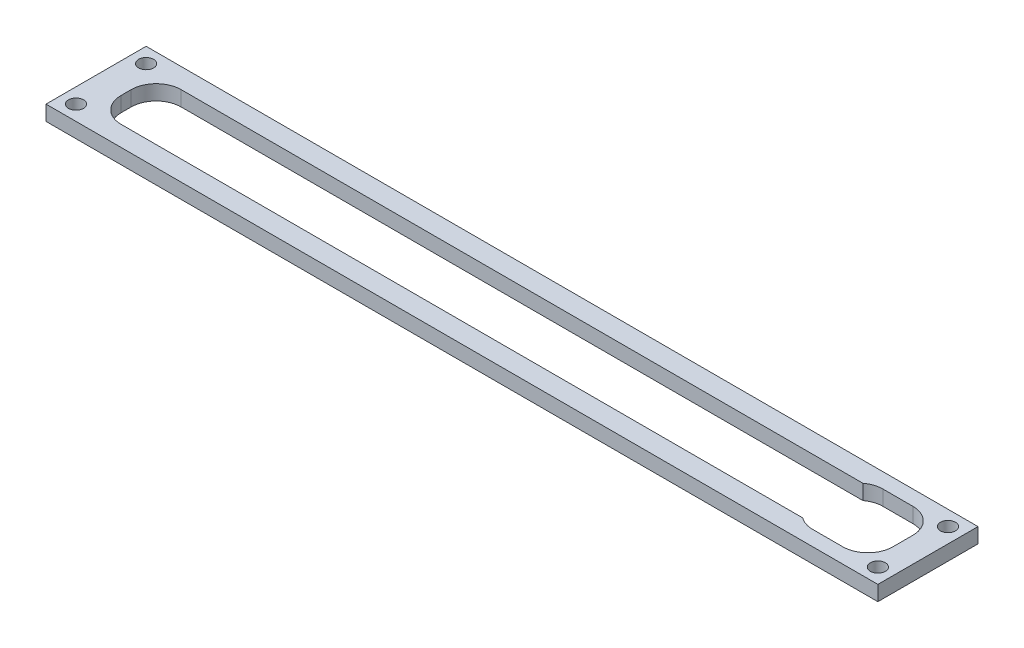
ISO-10303-21;
HEADER;
FILE_DESCRIPTION(('STEP AP214'),'2;1');
FILE_NAME('part.step','',(''),(''),'','','');
FILE_SCHEMA(('AUTOMOTIVE_DESIGN { 1 0 10303 214 1 1 1 1 }'));
ENDSEC;
DATA;
#1=APPLICATION_CONTEXT('core data for automotive mechanical design processes');
#2=APPLICATION_PROTOCOL_DEFINITION('international standard','automotive_design',2000,#1);
#3=PRODUCT_CONTEXT('',#1,'mechanical');
#4=PRODUCT('Part','Part','',(#3));
#5=PRODUCT_RELATED_PRODUCT_CATEGORY('part','',(#4));
#6=PRODUCT_DEFINITION_FORMATION('','',#4);
#7=PRODUCT_DEFINITION_CONTEXT('part definition',#1,'design');
#8=PRODUCT_DEFINITION('design','',#6,#7);
#9=PRODUCT_DEFINITION_SHAPE('','',#8);
#10=(LENGTH_UNIT() NAMED_UNIT(*) SI_UNIT(.MILLI.,.METRE.));
#11=(NAMED_UNIT(*) PLANE_ANGLE_UNIT() SI_UNIT($,.RADIAN.));
#12=(NAMED_UNIT(*) SI_UNIT($,.STERADIAN.) SOLID_ANGLE_UNIT());
#13=UNCERTAINTY_MEASURE_WITH_UNIT(LENGTH_MEASURE(1.E-05),#10,'distance_accuracy_value','');
#14=(GEOMETRIC_REPRESENTATION_CONTEXT(3) GLOBAL_UNCERTAINTY_ASSIGNED_CONTEXT((#13)) GLOBAL_UNIT_ASSIGNED_CONTEXT((#10,
#11,#12)) REPRESENTATION_CONTEXT('',''));
#15=CARTESIAN_POINT('',(0.,0.,0.));
#16=DIRECTION('',(0.,0.,1.));
#17=DIRECTION('',(1.,0.,0.));
#18=AXIS2_PLACEMENT_3D('',#15,#16,#17);
#19=CARTESIAN_POINT('',(0.,3.,0.));
#20=DIRECTION('',(0.,-1.,0.));
#21=DIRECTION('',(0.,0.,-1.));
#22=AXIS2_PLACEMENT_3D('',#19,#20,#21);
#23=PLANE('',#22);
#24=DIRECTION('',(0.,0.,1.));
#25=VECTOR('',#24,1.);
#26=CARTESIAN_POINT('',(0.,3.,0.));
#27=LINE('',#26,#25);
#28=CARTESIAN_POINT('',(0.,3.,-20.));
#29=VERTEX_POINT('',#28);
#30=CARTESIAN_POINT('',(0.,3.,0.));
#31=VERTEX_POINT('',#30);
#32=EDGE_CURVE('E250',#29,#31,#27,.T.);
#33=ORIENTED_EDGE('',*,*,#32,.T.);
#34=DIRECTION('',(1.,0.,0.));
#35=VECTOR('',#34,1.);
#36=CARTESIAN_POINT('',(0.,3.,0.));
#37=LINE('',#36,#35);
#38=CARTESIAN_POINT('',(166.159725664004,3.,0.));
#39=VERTEX_POINT('',#38);
#40=EDGE_CURVE('E253',#31,#39,#37,.T.);
#41=ORIENTED_EDGE('',*,*,#40,.T.);
#42=DIRECTION('',(0.,0.,-1.));
#43=VECTOR('',#42,1.);
#44=CARTESIAN_POINT('',(166.159725664004,3.,0.));
#45=LINE('',#44,#43);
#46=CARTESIAN_POINT('',(166.159725664004,3.,-20.));
#47=VERTEX_POINT('',#46);
#48=EDGE_CURVE('E256',#39,#47,#45,.T.);
#49=ORIENTED_EDGE('',*,*,#48,.T.);
#50=DIRECTION('',(-1.,0.,0.));
#51=VECTOR('',#50,1.);
#52=CARTESIAN_POINT('',(0.,3.,-20.));
#53=LINE('',#52,#51);
#54=EDGE_CURVE('E258',#47,#29,#53,.T.);
#55=ORIENTED_EDGE('',*,*,#54,.T.);
#56=EDGE_LOOP('',(#33,#41,#49,#55));
#57=FACE_BOUND('',#56,.T.);
#58=DIRECTION('',(-1.,0.,0.));
#59=VECTOR('',#58,1.);
#60=CARTESIAN_POINT('',(5.99999999999999,3.,-16.));
#61=LINE('',#60,#59);
#62=CARTESIAN_POINT('',(147.159725664004,3.,-16.));
#63=VERTEX_POINT('',#62);
#64=CARTESIAN_POINT('',(11.,3.,-16.));
#65=VERTEX_POINT('',#64);
#66=EDGE_CURVE('E243',#63,#65,#61,.T.);
#67=ORIENTED_EDGE('',*,*,#66,.F.);
#68=CARTESIAN_POINT('',(150.159725664004,3.,-12.));
#69=DIRECTION('',(0.,-1.,0.));
#70=DIRECTION('',(0.,0.,-1.));
#71=AXIS2_PLACEMENT_3D('',#68,#69,#70);
#72=CIRCLE('',#71,5.);
#73=CARTESIAN_POINT('',(150.159725664004,3.,-17.));
#74=VERTEX_POINT('',#73);
#75=EDGE_CURVE('E193',#63,#74,#72,.T.);
#76=ORIENTED_EDGE('',*,*,#75,.T.);
#77=DIRECTION('',(-1.,0.,0.));
#78=VECTOR('',#77,1.);
#79=CARTESIAN_POINT('',(147.159725664004,3.,-17.));
#80=LINE('',#79,#78);
#81=CARTESIAN_POINT('',(156.159725664004,3.,-17.));
#82=VERTEX_POINT('',#81);
#83=EDGE_CURVE('E205',#82,#74,#80,.T.);
#84=ORIENTED_EDGE('',*,*,#83,.F.);
#85=CARTESIAN_POINT('',(156.159725664004,3.,-12.));
#86=DIRECTION('',(0.,-1.,0.));
#87=DIRECTION('',(0.,0.,-1.));
#88=AXIS2_PLACEMENT_3D('',#85,#86,#87);
#89=CIRCLE('',#88,5.);
#90=CARTESIAN_POINT('',(161.159725664004,3.,-12.));
#91=VERTEX_POINT('',#90);
#92=EDGE_CURVE('E185',#82,#91,#89,.T.);
#93=ORIENTED_EDGE('',*,*,#92,.T.);
#94=DIRECTION('',(0.,0.,-1.));
#95=VECTOR('',#94,1.);
#96=CARTESIAN_POINT('',(161.159725664004,3.,-17.));
#97=LINE('',#96,#95);
#98=CARTESIAN_POINT('',(161.159725664004,3.,-8.00000000000001));
#99=VERTEX_POINT('',#98);
#100=EDGE_CURVE('E202',#99,#91,#97,.T.);
#101=ORIENTED_EDGE('',*,*,#100,.F.);
#102=CARTESIAN_POINT('',(156.159725664004,3.,-8.00000000000001));
#103=DIRECTION('',(0.,-1.,0.));
#104=DIRECTION('',(0.,0.,-1.));
#105=AXIS2_PLACEMENT_3D('',#102,#103,#104);
#106=CIRCLE('',#105,5.);
#107=CARTESIAN_POINT('',(156.159725664004,3.,-3.00000000000001));
#108=VERTEX_POINT('',#107);
#109=EDGE_CURVE('E189',#99,#108,#106,.T.);
#110=ORIENTED_EDGE('',*,*,#109,.T.);
#111=DIRECTION('',(1.,0.,0.));
#112=VECTOR('',#111,1.);
#113=CARTESIAN_POINT('',(147.159725664004,3.,-3.));
#114=LINE('',#113,#112);
#115=CARTESIAN_POINT('',(150.159725664004,3.,-3.));
#116=VERTEX_POINT('',#115);
#117=EDGE_CURVE('E200',#116,#108,#114,.T.);
#118=ORIENTED_EDGE('',*,*,#117,.F.);
#119=CARTESIAN_POINT('',(150.159725664004,3.,-8.00000000000001));
#120=DIRECTION('',(0.,-1.,0.));
#121=DIRECTION('',(0.,0.,-1.));
#122=AXIS2_PLACEMENT_3D('',#119,#120,#121);
#123=CIRCLE('',#122,5.);
#124=CARTESIAN_POINT('',(147.159725664004,3.,-4.00000000000002));
#125=VERTEX_POINT('',#124);
#126=EDGE_CURVE('E43',#116,#125,#123,.T.);
#127=ORIENTED_EDGE('',*,*,#126,.T.);
#128=DIRECTION('',(1.,0.,0.));
#129=VECTOR('',#128,1.);
#130=CARTESIAN_POINT('',(5.99999999999999,3.,-4.00000000000002));
#131=LINE('',#130,#129);
#132=CARTESIAN_POINT('',(11.,3.,-4.00000000000002));
#133=VERTEX_POINT('',#132);
#134=EDGE_CURVE('E162',#133,#125,#131,.T.);
#135=ORIENTED_EDGE('',*,*,#134,.F.);
#136=CARTESIAN_POINT('',(11.,3.,-9.00000000000001));
#137=DIRECTION('',(0.,-1.,0.));
#138=DIRECTION('',(0.,0.,-1.));
#139=AXIS2_PLACEMENT_3D('',#136,#137,#138);
#140=CIRCLE('',#139,5.);
#141=CARTESIAN_POINT('',(5.99999999999999,3.,-9.00000000000001));
#142=VERTEX_POINT('',#141);
#143=EDGE_CURVE('E179',#133,#142,#140,.T.);
#144=ORIENTED_EDGE('',*,*,#143,.T.);
#145=DIRECTION('',(0.,0.,1.));
#146=VECTOR('',#145,1.);
#147=CARTESIAN_POINT('',(5.99999999999999,3.,-16.));
#148=LINE('',#147,#146);
#149=CARTESIAN_POINT('',(5.99999999999999,3.,-11.));
#150=VERTEX_POINT('',#149);
#151=EDGE_CURVE('E239',#150,#142,#148,.T.);
#152=ORIENTED_EDGE('',*,*,#151,.F.);
#153=CARTESIAN_POINT('',(11.,3.,-11.));
#154=DIRECTION('',(0.,-1.,0.));
#155=DIRECTION('',(0.,0.,-1.));
#156=AXIS2_PLACEMENT_3D('',#153,#154,#155);
#157=CIRCLE('',#156,5.);
#158=EDGE_CURVE('E183',#150,#65,#157,.T.);
#159=ORIENTED_EDGE('',*,*,#158,.T.);
#160=EDGE_LOOP('',(#67,#76,#84,#93,#101,#110,#118,#127,#135,#144,#152,#159));
#161=FACE_BOUND('',#160,.T.);
#162=CARTESIAN_POINT('',(3.,3.,-17.));
#163=DIRECTION('',(0.,1.,0.));
#164=DIRECTION('',(0.,0.,1.));
#165=AXIS2_PLACEMENT_3D('',#162,#163,#164);
#166=CIRCLE('',#165,1.5);
#167=CARTESIAN_POINT('',(3.,3.,-15.5));
#168=VERTEX_POINT('',#167);
#169=EDGE_CURVE('E234',#168,#168,#166,.T.);
#170=ORIENTED_EDGE('',*,*,#169,.F.);
#171=EDGE_LOOP('',(#170));
#172=FACE_BOUND('',#171,.T.);
#173=CARTESIAN_POINT('',(3.,3.,-3.));
#174=DIRECTION('',(0.,1.,0.));
#175=DIRECTION('',(0.,0.,-1.));
#176=AXIS2_PLACEMENT_3D('',#173,#174,#175);
#177=CIRCLE('',#176,1.5);
#178=CARTESIAN_POINT('',(3.,3.,-4.5));
#179=VERTEX_POINT('',#178);
#180=EDGE_CURVE('E228',#179,#179,#177,.T.);
#181=ORIENTED_EDGE('',*,*,#180,.F.);
#182=EDGE_LOOP('',(#181));
#183=FACE_BOUND('',#182,.T.);
#184=CARTESIAN_POINT('',(163.159725664004,3.,-3.00000000000002));
#185=DIRECTION('',(0.,1.,0.));
#186=DIRECTION('',(0.,0.,1.));
#187=AXIS2_PLACEMENT_3D('',#184,#185,#186);
#188=CIRCLE('',#187,1.5);
#189=CARTESIAN_POINT('',(163.159725664004,3.,-1.50000000000002));
#190=VERTEX_POINT('',#189);
#191=EDGE_CURVE('E222',#190,#190,#188,.T.);
#192=ORIENTED_EDGE('',*,*,#191,.F.);
#193=EDGE_LOOP('',(#192));
#194=FACE_BOUND('',#193,.T.);
#195=CARTESIAN_POINT('',(163.159725664004,3.,-17.0000000000001));
#196=DIRECTION('',(0.,1.,0.));
#197=DIRECTION('',(0.,0.,-1.));
#198=AXIS2_PLACEMENT_3D('',#195,#196,#197);
#199=CIRCLE('',#198,1.5);
#200=CARTESIAN_POINT('',(163.159725664004,3.,-18.5000000000001));
#201=VERTEX_POINT('',#200);
#202=EDGE_CURVE('E216',#201,#201,#199,.T.);
#203=ORIENTED_EDGE('',*,*,#202,.F.);
#204=EDGE_LOOP('',(#203));
#205=FACE_BOUND('',#204,.T.);
#206=ADVANCED_FACE('F35',(#57,#161,#172,#183,#194,#205),#23,.F.);
#207=CARTESIAN_POINT('',(0.,0.,0.));
#208=DIRECTION('',(0.,-1.,0.));
#209=DIRECTION('',(0.,0.,-1.));
#210=AXIS2_PLACEMENT_3D('',#207,#208,#209);
#211=PLANE('',#210);
#212=DIRECTION('',(-1.,0.,0.));
#213=VECTOR('',#212,1.);
#214=CARTESIAN_POINT('',(147.159725664004,0.,-17.));
#215=LINE('',#214,#213);
#216=CARTESIAN_POINT('',(156.159725664004,0.,-17.));
#217=VERTEX_POINT('',#216);
#218=CARTESIAN_POINT('',(150.159725664004,0.,-17.));
#219=VERTEX_POINT('',#218);
#220=EDGE_CURVE('E165',#217,#219,#215,.T.);
#221=ORIENTED_EDGE('',*,*,#220,.T.);
#222=CARTESIAN_POINT('',(150.159725664004,0.,-12.));
#223=DIRECTION('',(0.,-1.,0.));
#224=DIRECTION('',(0.,0.,-1.));
#225=AXIS2_PLACEMENT_3D('',#222,#223,#224);
#226=CIRCLE('',#225,5.);
#227=CARTESIAN_POINT('',(147.159725664004,0.,-16.));
#228=VERTEX_POINT('',#227);
#229=EDGE_CURVE('E195',#219,#228,#226,.F.);
#230=ORIENTED_EDGE('',*,*,#229,.T.);
#231=DIRECTION('',(-1.,0.,0.));
#232=VECTOR('',#231,1.);
#233=CARTESIAN_POINT('',(5.99999999999999,0.,-16.));
#234=LINE('',#233,#232);
#235=CARTESIAN_POINT('',(11.,0.,-16.));
#236=VERTEX_POINT('',#235);
#237=EDGE_CURVE('E154',#228,#236,#234,.T.);
#238=ORIENTED_EDGE('',*,*,#237,.T.);
#239=CARTESIAN_POINT('',(11.,0.,-11.));
#240=DIRECTION('',(0.,-1.,0.));
#241=DIRECTION('',(0.,0.,-1.));
#242=AXIS2_PLACEMENT_3D('',#239,#240,#241);
#243=CIRCLE('',#242,5.);
#244=CARTESIAN_POINT('',(5.99999999999999,0.,-11.));
#245=VERTEX_POINT('',#244);
#246=EDGE_CURVE('E181',#236,#245,#243,.F.);
#247=ORIENTED_EDGE('',*,*,#246,.T.);
#248=DIRECTION('',(0.,0.,1.));
#249=VECTOR('',#248,1.);
#250=CARTESIAN_POINT('',(5.99999999999999,0.,-16.));
#251=LINE('',#250,#249);
#252=CARTESIAN_POINT('',(5.99999999999999,0.,-9.00000000000001));
#253=VERTEX_POINT('',#252);
#254=EDGE_CURVE('E155',#245,#253,#251,.T.);
#255=ORIENTED_EDGE('',*,*,#254,.T.);
#256=CARTESIAN_POINT('',(11.,0.,-9.00000000000001));
#257=DIRECTION('',(0.,-1.,0.));
#258=DIRECTION('',(0.,0.,-1.));
#259=AXIS2_PLACEMENT_3D('',#256,#257,#258);
#260=CIRCLE('',#259,5.);
#261=CARTESIAN_POINT('',(11.,0.,-4.00000000000002));
#262=VERTEX_POINT('',#261);
#263=EDGE_CURVE('E151',#253,#262,#260,.F.);
#264=ORIENTED_EDGE('',*,*,#263,.T.);
#265=DIRECTION('',(1.,0.,0.));
#266=VECTOR('',#265,1.);
#267=CARTESIAN_POINT('',(5.99999999999999,0.,-4.00000000000002));
#268=LINE('',#267,#266);
#269=CARTESIAN_POINT('',(147.159725664004,0.,-4.00000000000002));
#270=VERTEX_POINT('',#269);
#271=EDGE_CURVE('E145',#262,#270,#268,.T.);
#272=ORIENTED_EDGE('',*,*,#271,.T.);
#273=CARTESIAN_POINT('',(150.159725664004,0.,-8.00000000000001));
#274=DIRECTION('',(0.,-1.,0.));
#275=DIRECTION('',(0.,0.,-1.));
#276=AXIS2_PLACEMENT_3D('',#273,#274,#275);
#277=CIRCLE('',#276,5.);
#278=CARTESIAN_POINT('',(150.159725664004,0.,-3.));
#279=VERTEX_POINT('',#278);
#280=EDGE_CURVE('E11',#270,#279,#277,.F.);
#281=ORIENTED_EDGE('',*,*,#280,.T.);
#282=DIRECTION('',(1.,0.,0.));
#283=VECTOR('',#282,1.);
#284=CARTESIAN_POINT('',(147.159725664004,0.,-3.));
#285=LINE('',#284,#283);
#286=CARTESIAN_POINT('',(156.159725664004,0.,-3.00000000000001));
#287=VERTEX_POINT('',#286);
#288=EDGE_CURVE('E212',#279,#287,#285,.T.);
#289=ORIENTED_EDGE('',*,*,#288,.T.);
#290=CARTESIAN_POINT('',(156.159725664004,0.,-8.00000000000001));
#291=DIRECTION('',(0.,-1.,0.));
#292=DIRECTION('',(0.,0.,-1.));
#293=AXIS2_PLACEMENT_3D('',#290,#291,#292);
#294=CIRCLE('',#293,5.);
#295=CARTESIAN_POINT('',(161.159725664004,0.,-8.00000000000001));
#296=VERTEX_POINT('',#295);
#297=EDGE_CURVE('E191',#287,#296,#294,.F.);
#298=ORIENTED_EDGE('',*,*,#297,.T.);
#299=DIRECTION('',(0.,0.,-1.));
#300=VECTOR('',#299,1.);
#301=CARTESIAN_POINT('',(161.159725664004,0.,-17.));
#302=LINE('',#301,#300);
#303=CARTESIAN_POINT('',(161.159725664004,0.,-12.));
#304=VERTEX_POINT('',#303);
#305=EDGE_CURVE('E300',#296,#304,#302,.T.);
#306=ORIENTED_EDGE('',*,*,#305,.T.);
#307=CARTESIAN_POINT('',(156.159725664004,0.,-12.));
#308=DIRECTION('',(0.,-1.,0.));
#309=DIRECTION('',(0.,0.,-1.));
#310=AXIS2_PLACEMENT_3D('',#307,#308,#309);
#311=CIRCLE('',#310,5.);
#312=EDGE_CURVE('E187',#304,#217,#311,.F.);
#313=ORIENTED_EDGE('',*,*,#312,.T.);
#314=EDGE_LOOP('',(#221,#230,#238,#247,#255,#264,#272,#281,#289,#298,#306,#313));
#315=FACE_BOUND('',#314,.T.);
#316=CARTESIAN_POINT('',(163.159725664004,0.,-3.00000000000002));
#317=DIRECTION('',(0.,1.,0.));
#318=DIRECTION('',(0.,0.,1.));
#319=AXIS2_PLACEMENT_3D('',#316,#317,#318);
#320=CIRCLE('',#319,1.5);
#321=CARTESIAN_POINT('',(163.159725664004,0.,-1.50000000000002));
#322=VERTEX_POINT('',#321);
#323=EDGE_CURVE('E219',#322,#322,#320,.T.);
#324=ORIENTED_EDGE('',*,*,#323,.T.);
#325=EDGE_LOOP('',(#324));
#326=FACE_BOUND('',#325,.T.);
#327=CARTESIAN_POINT('',(3.,0.,-17.));
#328=DIRECTION('',(0.,1.,0.));
#329=DIRECTION('',(0.,0.,1.));
#330=AXIS2_PLACEMENT_3D('',#327,#328,#329);
#331=CIRCLE('',#330,1.5);
#332=CARTESIAN_POINT('',(3.,0.,-15.5));
#333=VERTEX_POINT('',#332);
#334=EDGE_CURVE('E231',#333,#333,#331,.T.);
#335=ORIENTED_EDGE('',*,*,#334,.T.);
#336=EDGE_LOOP('',(#335));
#337=FACE_BOUND('',#336,.T.);
#338=DIRECTION('',(0.,0.,1.));
#339=VECTOR('',#338,1.);
#340=CARTESIAN_POINT('',(0.,0.,0.));
#341=LINE('',#340,#339);
#342=CARTESIAN_POINT('',(0.,0.,-20.));
#343=VERTEX_POINT('',#342);
#344=CARTESIAN_POINT('',(0.,0.,0.));
#345=VERTEX_POINT('',#344);
#346=EDGE_CURVE('E246',#343,#345,#341,.T.);
#347=ORIENTED_EDGE('',*,*,#346,.F.);
#348=DIRECTION('',(-1.,0.,0.));
#349=VECTOR('',#348,1.);
#350=CARTESIAN_POINT('',(0.,0.,-20.));
#351=LINE('',#350,#349);
#352=CARTESIAN_POINT('',(166.159725664004,0.,-20.));
#353=VERTEX_POINT('',#352);
#354=EDGE_CURVE('E254',#353,#343,#351,.T.);
#355=ORIENTED_EDGE('',*,*,#354,.F.);
#356=DIRECTION('',(0.,0.,-1.));
#357=VECTOR('',#356,1.);
#358=CARTESIAN_POINT('',(166.159725664004,0.,0.));
#359=LINE('',#358,#357);
#360=CARTESIAN_POINT('',(166.159725664004,0.,0.));
#361=VERTEX_POINT('',#360);
#362=EDGE_CURVE('E265',#361,#353,#359,.T.);
#363=ORIENTED_EDGE('',*,*,#362,.F.);
#364=DIRECTION('',(1.,0.,0.));
#365=VECTOR('',#364,1.);
#366=CARTESIAN_POINT('',(0.,0.,0.));
#367=LINE('',#366,#365);
#368=EDGE_CURVE('E263',#345,#361,#367,.T.);
#369=ORIENTED_EDGE('',*,*,#368,.F.);
#370=EDGE_LOOP('',(#347,#355,#363,#369));
#371=FACE_BOUND('',#370,.T.);
#372=CARTESIAN_POINT('',(3.,0.,-3.));
#373=DIRECTION('',(0.,1.,0.));
#374=DIRECTION('',(0.,0.,-1.));
#375=AXIS2_PLACEMENT_3D('',#372,#373,#374);
#376=CIRCLE('',#375,1.5);
#377=CARTESIAN_POINT('',(3.,0.,-4.5));
#378=VERTEX_POINT('',#377);
#379=EDGE_CURVE('E225',#378,#378,#376,.T.);
#380=ORIENTED_EDGE('',*,*,#379,.T.);
#381=EDGE_LOOP('',(#380));
#382=FACE_BOUND('',#381,.T.);
#383=CARTESIAN_POINT('',(163.159725664004,0.,-17.0000000000001));
#384=DIRECTION('',(0.,1.,0.));
#385=DIRECTION('',(0.,0.,-1.));
#386=AXIS2_PLACEMENT_3D('',#383,#384,#385);
#387=CIRCLE('',#386,1.5);
#388=CARTESIAN_POINT('',(163.159725664004,0.,-18.5000000000001));
#389=VERTEX_POINT('',#388);
#390=EDGE_CURVE('E214',#389,#389,#387,.T.);
#391=ORIENTED_EDGE('',*,*,#390,.T.);
#392=EDGE_LOOP('',(#391));
#393=FACE_BOUND('',#392,.T.);
#394=ADVANCED_FACE('F148',(#315,#326,#337,#371,#382,#393),#211,.T.);
#395=CARTESIAN_POINT('',(0.,3.,0.));
#396=DIRECTION('',(1.,0.,0.));
#397=DIRECTION('',(0.,0.,-1.));
#398=AXIS2_PLACEMENT_3D('',#395,#396,#397);
#399=PLANE('',#398);
#400=ORIENTED_EDGE('',*,*,#346,.T.);
#401=DIRECTION('',(0.,-1.,0.));
#402=VECTOR('',#401,1.);
#403=CARTESIAN_POINT('',(0.,3.,0.));
#404=LINE('',#403,#402);
#405=EDGE_CURVE('E276',#31,#345,#404,.T.);
#406=ORIENTED_EDGE('',*,*,#405,.F.);
#407=ORIENTED_EDGE('',*,*,#32,.F.);
#408=DIRECTION('',(0.,-1.,0.));
#409=VECTOR('',#408,1.);
#410=CARTESIAN_POINT('',(0.,3.,-20.));
#411=LINE('',#410,#409);
#412=EDGE_CURVE('E260',#29,#343,#411,.T.);
#413=ORIENTED_EDGE('',*,*,#412,.T.);
#414=EDGE_LOOP('',(#400,#406,#407,#413));
#415=FACE_BOUND('',#414,.T.);
#416=ADVANCED_FACE('F331',(#415),#399,.F.);
#417=CARTESIAN_POINT('',(0.,3.,0.));
#418=DIRECTION('',(0.,0.,-1.));
#419=DIRECTION('',(-1.,0.,0.));
#420=AXIS2_PLACEMENT_3D('',#417,#418,#419);
#421=PLANE('',#420);
#422=ORIENTED_EDGE('',*,*,#368,.T.);
#423=DIRECTION('',(0.,-1.,0.));
#424=VECTOR('',#423,1.);
#425=CARTESIAN_POINT('',(166.159725664004,3.,0.));
#426=LINE('',#425,#424);
#427=EDGE_CURVE('E273',#39,#361,#426,.T.);
#428=ORIENTED_EDGE('',*,*,#427,.F.);
#429=ORIENTED_EDGE('',*,*,#40,.F.);
#430=ORIENTED_EDGE('',*,*,#405,.T.);
#431=EDGE_LOOP('',(#422,#428,#429,#430));
#432=FACE_BOUND('',#431,.T.);
#433=ADVANCED_FACE('F344',(#432),#421,.F.);
#434=CARTESIAN_POINT('',(166.159725664004,3.,0.));
#435=DIRECTION('',(-1.,0.,0.));
#436=DIRECTION('',(0.,0.,1.));
#437=AXIS2_PLACEMENT_3D('',#434,#435,#436);
#438=PLANE('',#437);
#439=ORIENTED_EDGE('',*,*,#362,.T.);
#440=DIRECTION('',(0.,-1.,0.));
#441=VECTOR('',#440,1.);
#442=CARTESIAN_POINT('',(166.159725664004,3.,-20.));
#443=LINE('',#442,#441);
#444=EDGE_CURVE('E270',#47,#353,#443,.T.);
#445=ORIENTED_EDGE('',*,*,#444,.F.);
#446=ORIENTED_EDGE('',*,*,#48,.F.);
#447=ORIENTED_EDGE('',*,*,#427,.T.);
#448=EDGE_LOOP('',(#439,#445,#446,#447));
#449=FACE_BOUND('',#448,.T.);
#450=ADVANCED_FACE('F340',(#449),#438,.F.);
#451=CARTESIAN_POINT('',(0.,3.,-20.));
#452=DIRECTION('',(0.,0.,1.));
#453=DIRECTION('',(1.,0.,0.));
#454=AXIS2_PLACEMENT_3D('',#451,#452,#453);
#455=PLANE('',#454);
#456=ORIENTED_EDGE('',*,*,#354,.T.);
#457=ORIENTED_EDGE('',*,*,#412,.F.);
#458=ORIENTED_EDGE('',*,*,#54,.F.);
#459=ORIENTED_EDGE('',*,*,#444,.T.);
#460=EDGE_LOOP('',(#456,#457,#458,#459));
#461=FACE_BOUND('',#460,.T.);
#462=ADVANCED_FACE('F337',(#461),#455,.F.);
#463=CARTESIAN_POINT('',(5.99999999999999,3.,-16.));
#464=DIRECTION('',(1.,0.,0.));
#465=DIRECTION('',(0.,0.,-1.));
#466=AXIS2_PLACEMENT_3D('',#463,#464,#465);
#467=PLANE('',#466);
#468=ORIENTED_EDGE('',*,*,#151,.T.);
#469=DIRECTION('',(0.,-1.,0.));
#470=VECTOR('',#469,1.);
#471=CARTESIAN_POINT('',(5.99999999999999,0.,-9.00000000000001));
#472=LINE('',#471,#470);
#473=EDGE_CURVE('E281',#142,#253,#472,.T.);
#474=ORIENTED_EDGE('',*,*,#473,.T.);
#475=ORIENTED_EDGE('',*,*,#254,.F.);
#476=DIRECTION('',(0.,-1.,0.));
#477=VECTOR('',#476,1.);
#478=CARTESIAN_POINT('',(5.99999999999999,3.,-11.));
#479=LINE('',#478,#477);
#480=EDGE_CURVE('E279',#245,#150,#479,.F.);
#481=ORIENTED_EDGE('',*,*,#480,.T.);
#482=EDGE_LOOP('',(#468,#474,#475,#481));
#483=FACE_BOUND('',#482,.T.);
#484=ADVANCED_FACE('F334',(#483),#467,.T.);
#485=CARTESIAN_POINT('',(5.99999999999999,3.,-4.00000000000002));
#486=DIRECTION('',(0.,0.,-1.));
#487=DIRECTION('',(-1.,0.,0.));
#488=AXIS2_PLACEMENT_3D('',#485,#486,#487);
#489=PLANE('',#488);
#490=ORIENTED_EDGE('',*,*,#271,.F.);
#491=DIRECTION('',(0.,-1.,0.));
#492=VECTOR('',#491,1.);
#493=CARTESIAN_POINT('',(11.,3.,-4.00000000000002));
#494=LINE('',#493,#492);
#495=EDGE_CURVE('E284',#262,#133,#494,.F.);
#496=ORIENTED_EDGE('',*,*,#495,.T.);
#497=ORIENTED_EDGE('',*,*,#134,.T.);
#498=DIRECTION('',(0.,1.,0.));
#499=VECTOR('',#498,1.);
#500=CARTESIAN_POINT('',(147.159725664004,0.,-4.00000000000002));
#501=LINE('',#500,#499);
#502=EDGE_CURVE('E159',#270,#125,#501,.T.);
#503=ORIENTED_EDGE('',*,*,#502,.F.);
#504=EDGE_LOOP('',(#490,#496,#497,#503));
#505=FACE_BOUND('',#504,.T.);
#506=ADVANCED_FACE('F160',(#505),#489,.T.);
#507=CARTESIAN_POINT('',(5.99999999999999,3.,-16.));
#508=DIRECTION('',(0.,0.,1.));
#509=DIRECTION('',(1.,0.,0.));
#510=AXIS2_PLACEMENT_3D('',#507,#508,#509);
#511=PLANE('',#510);
#512=ORIENTED_EDGE('',*,*,#66,.T.);
#513=DIRECTION('',(0.,-1.,0.));
#514=VECTOR('',#513,1.);
#515=CARTESIAN_POINT('',(11.,0.,-16.));
#516=LINE('',#515,#514);
#517=EDGE_CURVE('E286',#65,#236,#516,.T.);
#518=ORIENTED_EDGE('',*,*,#517,.T.);
#519=ORIENTED_EDGE('',*,*,#237,.F.);
#520=DIRECTION('',(0.,1.,0.));
#521=VECTOR('',#520,1.);
#522=CARTESIAN_POINT('',(147.159725664004,0.,-16.));
#523=LINE('',#522,#521);
#524=EDGE_CURVE('E164',#228,#63,#523,.T.);
#525=ORIENTED_EDGE('',*,*,#524,.T.);
#526=EDGE_LOOP('',(#512,#518,#519,#525));
#527=FACE_BOUND('',#526,.T.);
#528=ADVANCED_FACE('F366',(#527),#511,.T.);
#529=CARTESIAN_POINT('',(3.,3.,-17.));
#530=DIRECTION('',(0.,-1.,0.));
#531=DIRECTION('',(0.,0.,-1.));
#532=AXIS2_PLACEMENT_3D('',#529,#530,#531);
#533=CYLINDRICAL_SURFACE('',#532,1.5);
#534=ORIENTED_EDGE('',*,*,#169,.T.);
#535=EDGE_LOOP('',(#534));
#536=FACE_BOUND('',#535,.T.);
#537=ORIENTED_EDGE('',*,*,#334,.F.);
#538=EDGE_LOOP('',(#537));
#539=FACE_BOUND('',#538,.T.);
#540=ADVANCED_FACE('F379',(#536,#539),#533,.F.);
#541=CARTESIAN_POINT('',(3.,3.,-3.));
#542=DIRECTION('',(0.,-1.,0.));
#543=DIRECTION('',(0.,0.,-1.));
#544=AXIS2_PLACEMENT_3D('',#541,#542,#543);
#545=CYLINDRICAL_SURFACE('',#544,1.5);
#546=ORIENTED_EDGE('',*,*,#180,.T.);
#547=EDGE_LOOP('',(#546));
#548=FACE_BOUND('',#547,.T.);
#549=ORIENTED_EDGE('',*,*,#379,.F.);
#550=EDGE_LOOP('',(#549));
#551=FACE_BOUND('',#550,.T.);
#552=ADVANCED_FACE('F384',(#548,#551),#545,.F.);
#553=CARTESIAN_POINT('',(163.159725664004,3.,-3.00000000000002));
#554=DIRECTION('',(0.,-1.,0.));
#555=DIRECTION('',(0.,0.,-1.));
#556=AXIS2_PLACEMENT_3D('',#553,#554,#555);
#557=CYLINDRICAL_SURFACE('',#556,1.5);
#558=ORIENTED_EDGE('',*,*,#191,.T.);
#559=EDGE_LOOP('',(#558));
#560=FACE_BOUND('',#559,.T.);
#561=ORIENTED_EDGE('',*,*,#323,.F.);
#562=EDGE_LOOP('',(#561));
#563=FACE_BOUND('',#562,.T.);
#564=ADVANCED_FACE('F388',(#560,#563),#557,.F.);
#565=CARTESIAN_POINT('',(163.159725664004,3.,-17.0000000000001));
#566=DIRECTION('',(0.,-1.,0.));
#567=DIRECTION('',(0.,0.,-1.));
#568=AXIS2_PLACEMENT_3D('',#565,#566,#567);
#569=CYLINDRICAL_SURFACE('',#568,1.5);
#570=ORIENTED_EDGE('',*,*,#202,.T.);
#571=EDGE_LOOP('',(#570));
#572=FACE_BOUND('',#571,.T.);
#573=ORIENTED_EDGE('',*,*,#390,.F.);
#574=EDGE_LOOP('',(#573));
#575=FACE_BOUND('',#574,.T.);
#576=ADVANCED_FACE('F392',(#572,#575),#569,.F.);
#577=CARTESIAN_POINT('',(147.159725664004,0.,-17.));
#578=DIRECTION('',(0.,0.,-1.));
#579=DIRECTION('',(-1.,0.,0.));
#580=AXIS2_PLACEMENT_3D('',#577,#578,#579);
#581=PLANE('',#580);
#582=ORIENTED_EDGE('',*,*,#220,.F.);
#583=DIRECTION('',(0.,1.,0.));
#584=VECTOR('',#583,1.);
#585=CARTESIAN_POINT('',(156.159725664004,3.,-17.));
#586=LINE('',#585,#584);
#587=EDGE_CURVE('E291',#217,#82,#586,.T.);
#588=ORIENTED_EDGE('',*,*,#587,.T.);
#589=ORIENTED_EDGE('',*,*,#83,.T.);
#590=DIRECTION('',(0.,1.,0.));
#591=VECTOR('',#590,1.);
#592=CARTESIAN_POINT('',(150.159725664004,0.,-17.));
#593=LINE('',#592,#591);
#594=EDGE_CURVE('E289',#74,#219,#593,.F.);
#595=ORIENTED_EDGE('',*,*,#594,.T.);
#596=EDGE_LOOP('',(#582,#588,#589,#595));
#597=FACE_BOUND('',#596,.T.);
#598=ADVANCED_FACE('F310',(#597),#581,.F.);
#599=CARTESIAN_POINT('',(161.159725664004,0.,-17.));
#600=DIRECTION('',(1.,0.,0.));
#601=DIRECTION('',(0.,0.,-1.));
#602=AXIS2_PLACEMENT_3D('',#599,#600,#601);
#603=PLANE('',#602);
#604=ORIENTED_EDGE('',*,*,#100,.T.);
#605=DIRECTION('',(0.,1.,0.));
#606=VECTOR('',#605,1.);
#607=CARTESIAN_POINT('',(161.159725664004,0.,-12.));
#608=LINE('',#607,#606);
#609=EDGE_CURVE('E171',#91,#304,#608,.F.);
#610=ORIENTED_EDGE('',*,*,#609,.T.);
#611=ORIENTED_EDGE('',*,*,#305,.F.);
#612=DIRECTION('',(0.,1.,0.));
#613=VECTOR('',#612,1.);
#614=CARTESIAN_POINT('',(161.159725664004,3.,-8.00000000000001));
#615=LINE('',#614,#613);
#616=EDGE_CURVE('E174',#296,#99,#615,.T.);
#617=ORIENTED_EDGE('',*,*,#616,.T.);
#618=EDGE_LOOP('',(#604,#610,#611,#617));
#619=FACE_BOUND('',#618,.T.);
#620=ADVANCED_FACE('F297',(#619),#603,.F.);
#621=CARTESIAN_POINT('',(147.159725664004,0.,-3.));
#622=DIRECTION('',(0.,0.,1.));
#623=DIRECTION('',(1.,0.,0.));
#624=AXIS2_PLACEMENT_3D('',#621,#622,#623);
#625=PLANE('',#624);
#626=ORIENTED_EDGE('',*,*,#117,.T.);
#627=DIRECTION('',(0.,1.,0.));
#628=VECTOR('',#627,1.);
#629=CARTESIAN_POINT('',(156.159725664004,0.,-3.00000000000001));
#630=LINE('',#629,#628);
#631=EDGE_CURVE('E50',#108,#287,#630,.F.);
#632=ORIENTED_EDGE('',*,*,#631,.T.);
#633=ORIENTED_EDGE('',*,*,#288,.F.);
#634=DIRECTION('',(0.,-1.,0.));
#635=VECTOR('',#634,1.);
#636=CARTESIAN_POINT('',(150.159725664004,0.,-3.));
#637=LINE('',#636,#635);
#638=EDGE_CURVE('E169',#279,#116,#637,.F.);
#639=ORIENTED_EDGE('',*,*,#638,.T.);
#640=EDGE_LOOP('',(#626,#632,#633,#639));
#641=FACE_BOUND('',#640,.T.);
#642=ADVANCED_FACE('F355',(#641),#625,.F.);
#643=CARTESIAN_POINT('',(11.,3.,-9.00000000000001));
#644=DIRECTION('',(0.,1.,0.));
#645=DIRECTION('',(0.,0.,1.));
#646=AXIS2_PLACEMENT_3D('',#643,#644,#645);
#647=CYLINDRICAL_SURFACE('',#646,5.);
#648=ORIENTED_EDGE('',*,*,#143,.F.);
#649=ORIENTED_EDGE('',*,*,#495,.F.);
#650=ORIENTED_EDGE('',*,*,#263,.F.);
#651=ORIENTED_EDGE('',*,*,#473,.F.);
#652=EDGE_LOOP('',(#648,#649,#650,#651));
#653=FACE_BOUND('',#652,.T.);
#654=ADVANCED_FACE('F352',(#653),#647,.F.);
#655=CARTESIAN_POINT('',(11.,3.,-11.));
#656=DIRECTION('',(0.,1.,0.));
#657=DIRECTION('',(0.,0.,1.));
#658=AXIS2_PLACEMENT_3D('',#655,#656,#657);
#659=CYLINDRICAL_SURFACE('',#658,5.);
#660=ORIENTED_EDGE('',*,*,#158,.F.);
#661=ORIENTED_EDGE('',*,*,#480,.F.);
#662=ORIENTED_EDGE('',*,*,#246,.F.);
#663=ORIENTED_EDGE('',*,*,#517,.F.);
#664=EDGE_LOOP('',(#660,#661,#662,#663));
#665=FACE_BOUND('',#664,.T.);
#666=ADVANCED_FACE('F323',(#665),#659,.F.);
#667=CARTESIAN_POINT('',(156.159725664004,0.,-12.));
#668=DIRECTION('',(0.,-1.,0.));
#669=DIRECTION('',(0.,0.,-1.));
#670=AXIS2_PLACEMENT_3D('',#667,#668,#669);
#671=CYLINDRICAL_SURFACE('',#670,5.);
#672=ORIENTED_EDGE('',*,*,#312,.F.);
#673=ORIENTED_EDGE('',*,*,#609,.F.);
#674=ORIENTED_EDGE('',*,*,#92,.F.);
#675=ORIENTED_EDGE('',*,*,#587,.F.);
#676=EDGE_LOOP('',(#672,#673,#674,#675));
#677=FACE_BOUND('',#676,.T.);
#678=ADVANCED_FACE('F307',(#677),#671,.F.);
#679=CARTESIAN_POINT('',(156.159725664004,0.,-8.00000000000001));
#680=DIRECTION('',(0.,-1.,0.));
#681=DIRECTION('',(0.,0.,-1.));
#682=AXIS2_PLACEMENT_3D('',#679,#680,#681);
#683=CYLINDRICAL_SURFACE('',#682,5.);
#684=ORIENTED_EDGE('',*,*,#297,.F.);
#685=ORIENTED_EDGE('',*,*,#631,.F.);
#686=ORIENTED_EDGE('',*,*,#109,.F.);
#687=ORIENTED_EDGE('',*,*,#616,.F.);
#688=EDGE_LOOP('',(#684,#685,#686,#687));
#689=FACE_BOUND('',#688,.T.);
#690=ADVANCED_FACE('F314',(#689),#683,.F.);
#691=CARTESIAN_POINT('',(150.159725664004,0.,-12.));
#692=DIRECTION('',(0.,1.,0.));
#693=DIRECTION('',(0.,0.,1.));
#694=AXIS2_PLACEMENT_3D('',#691,#692,#693);
#695=CYLINDRICAL_SURFACE('',#694,5.);
#696=ORIENTED_EDGE('',*,*,#229,.F.);
#697=ORIENTED_EDGE('',*,*,#594,.F.);
#698=ORIENTED_EDGE('',*,*,#75,.F.);
#699=ORIENTED_EDGE('',*,*,#524,.F.);
#700=EDGE_LOOP('',(#696,#697,#698,#699));
#701=FACE_BOUND('',#700,.T.);
#702=ADVANCED_FACE('F316',(#701),#695,.F.);
#703=CARTESIAN_POINT('',(150.159725664004,0.,-8.00000000000001));
#704=DIRECTION('',(0.,-1.,0.));
#705=DIRECTION('',(0.,0.,-1.));
#706=AXIS2_PLACEMENT_3D('',#703,#704,#705);
#707=CYLINDRICAL_SURFACE('',#706,5.);
#708=ORIENTED_EDGE('',*,*,#280,.F.);
#709=ORIENTED_EDGE('',*,*,#502,.T.);
#710=ORIENTED_EDGE('',*,*,#126,.F.);
#711=ORIENTED_EDGE('',*,*,#638,.F.);
#712=EDGE_LOOP('',(#708,#709,#710,#711));
#713=FACE_BOUND('',#712,.T.);
#714=ADVANCED_FACE('F37',(#713),#707,.F.);
#715=CLOSED_SHELL('',(#206,#394,#416,#433,#450,#462,#484,#506,#528,#540,#552,#564,#576,#598,
#620,#642,#654,#666,#678,#690,#702,#714));
#716=MANIFOLD_SOLID_BREP('B2',#715);
#717=ADVANCED_BREP_SHAPE_REPRESENTATION('',(#18,#716),#14);
#718=SHAPE_DEFINITION_REPRESENTATION(#9,#717);
ENDSEC;
END-ISO-10303-21;
